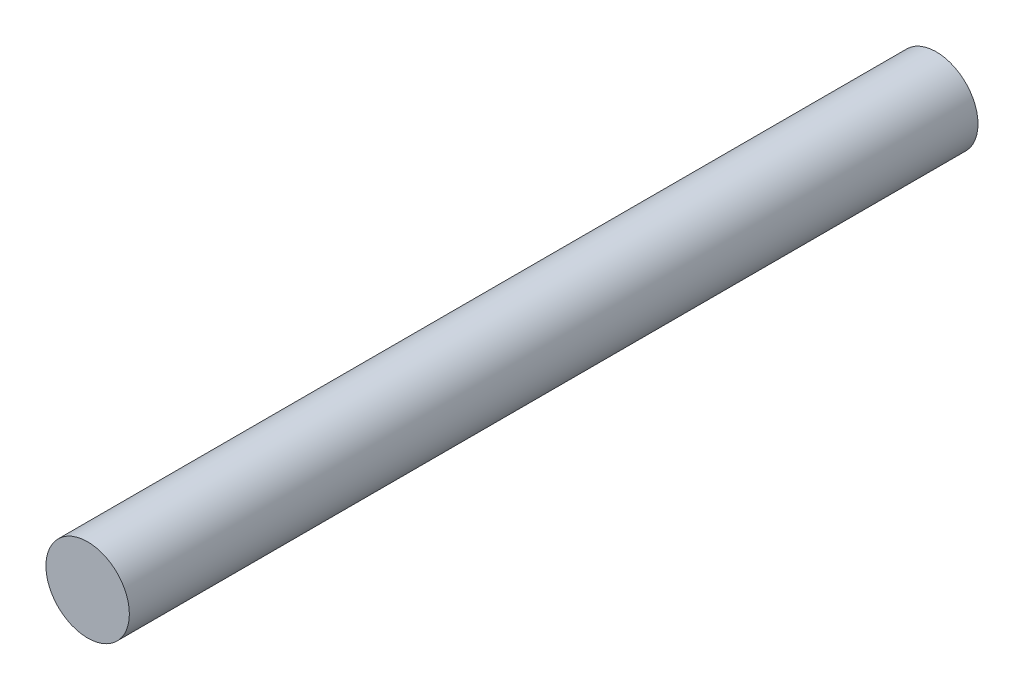
ISO-10303-21;
HEADER;
FILE_DESCRIPTION(('STEP AP214'),'2;1');
FILE_NAME('part.step','',(''),(''),'','','');
FILE_SCHEMA(('AUTOMOTIVE_DESIGN { 1 0 10303 214 1 1 1 1 }'));
ENDSEC;
DATA;
#1=APPLICATION_CONTEXT('core data for automotive mechanical design processes');
#2=APPLICATION_PROTOCOL_DEFINITION('international standard','automotive_design',2000,#1);
#3=PRODUCT_CONTEXT('',#1,'mechanical');
#4=PRODUCT('Part','Part','',(#3));
#5=PRODUCT_RELATED_PRODUCT_CATEGORY('part','',(#4));
#6=PRODUCT_DEFINITION_FORMATION('','',#4);
#7=PRODUCT_DEFINITION_CONTEXT('part definition',#1,'design');
#8=PRODUCT_DEFINITION('design','',#6,#7);
#9=PRODUCT_DEFINITION_SHAPE('','',#8);
#10=(LENGTH_UNIT() NAMED_UNIT(*) SI_UNIT(.MILLI.,.METRE.));
#11=(NAMED_UNIT(*) PLANE_ANGLE_UNIT() SI_UNIT($,.RADIAN.));
#12=(NAMED_UNIT(*) SI_UNIT($,.STERADIAN.) SOLID_ANGLE_UNIT());
#13=UNCERTAINTY_MEASURE_WITH_UNIT(LENGTH_MEASURE(1.E-05),#10,'distance_accuracy_value','');
#14=(GEOMETRIC_REPRESENTATION_CONTEXT(3) GLOBAL_UNCERTAINTY_ASSIGNED_CONTEXT((#13)) GLOBAL_UNIT_ASSIGNED_CONTEXT((#10,
#11,#12)) REPRESENTATION_CONTEXT('',''));
#15=CARTESIAN_POINT('',(0.,0.,0.));
#16=DIRECTION('',(0.,0.,1.));
#17=DIRECTION('',(1.,0.,0.));
#18=AXIS2_PLACEMENT_3D('',#15,#16,#17);
#19=CARTESIAN_POINT('',(0.,0.,96.8756));
#20=DIRECTION('',(0.,0.,-1.));
#21=DIRECTION('',(-1.,0.,0.));
#22=AXIS2_PLACEMENT_3D('',#19,#20,#21);
#23=CYLINDRICAL_SURFACE('',#22,4.7625);
#24=CARTESIAN_POINT('',(0.,0.,96.8756));
#25=DIRECTION('',(0.,0.,1.));
#26=DIRECTION('',(1.,0.,0.));
#27=AXIS2_PLACEMENT_3D('',#24,#25,#26);
#28=CIRCLE('',#27,4.7625);
#29=CARTESIAN_POINT('',(4.7625,0.,96.8756));
#30=VERTEX_POINT('',#29);
#31=EDGE_CURVE('E10',#30,#30,#28,.T.);
#32=ORIENTED_EDGE('',*,*,#31,.F.);
#33=EDGE_LOOP('',(#32));
#34=FACE_BOUND('',#33,.T.);
#35=CARTESIAN_POINT('',(0.,0.,0.));
#36=DIRECTION('',(0.,0.,1.));
#37=DIRECTION('',(1.,0.,0.));
#38=AXIS2_PLACEMENT_3D('',#35,#36,#37);
#39=CIRCLE('',#38,4.7625);
#40=CARTESIAN_POINT('',(4.7625,0.,0.));
#41=VERTEX_POINT('',#40);
#42=EDGE_CURVE('E34',#41,#41,#39,.T.);
#43=ORIENTED_EDGE('',*,*,#42,.T.);
#44=EDGE_LOOP('',(#43));
#45=FACE_BOUND('',#44,.T.);
#46=ADVANCED_FACE('F31',(#34,#45),#23,.T.);
#47=CARTESIAN_POINT('',(0.,0.,96.8756));
#48=DIRECTION('',(0.,0.,1.));
#49=DIRECTION('',(1.,0.,0.));
#50=AXIS2_PLACEMENT_3D('',#47,#48,#49);
#51=PLANE('',#50);
#52=ORIENTED_EDGE('',*,*,#31,.T.);
#53=EDGE_LOOP('',(#52));
#54=FACE_BOUND('',#53,.T.);
#55=ADVANCED_FACE('F46',(#54),#51,.T.);
#56=CARTESIAN_POINT('',(0.,0.,0.));
#57=DIRECTION('',(0.,0.,1.));
#58=DIRECTION('',(1.,0.,0.));
#59=AXIS2_PLACEMENT_3D('',#56,#57,#58);
#60=PLANE('',#59);
#61=ORIENTED_EDGE('',*,*,#42,.F.);
#62=EDGE_LOOP('',(#61));
#63=FACE_BOUND('',#62,.T.);
#64=ADVANCED_FACE('F44',(#63),#60,.F.);
#65=CLOSED_SHELL('',(#46,#55,#64));
#66=MANIFOLD_SOLID_BREP('B2',#65);
#67=ADVANCED_BREP_SHAPE_REPRESENTATION('',(#18,#66),#14);
#68=SHAPE_DEFINITION_REPRESENTATION(#9,#67);
ENDSEC;
END-ISO-10303-21;
